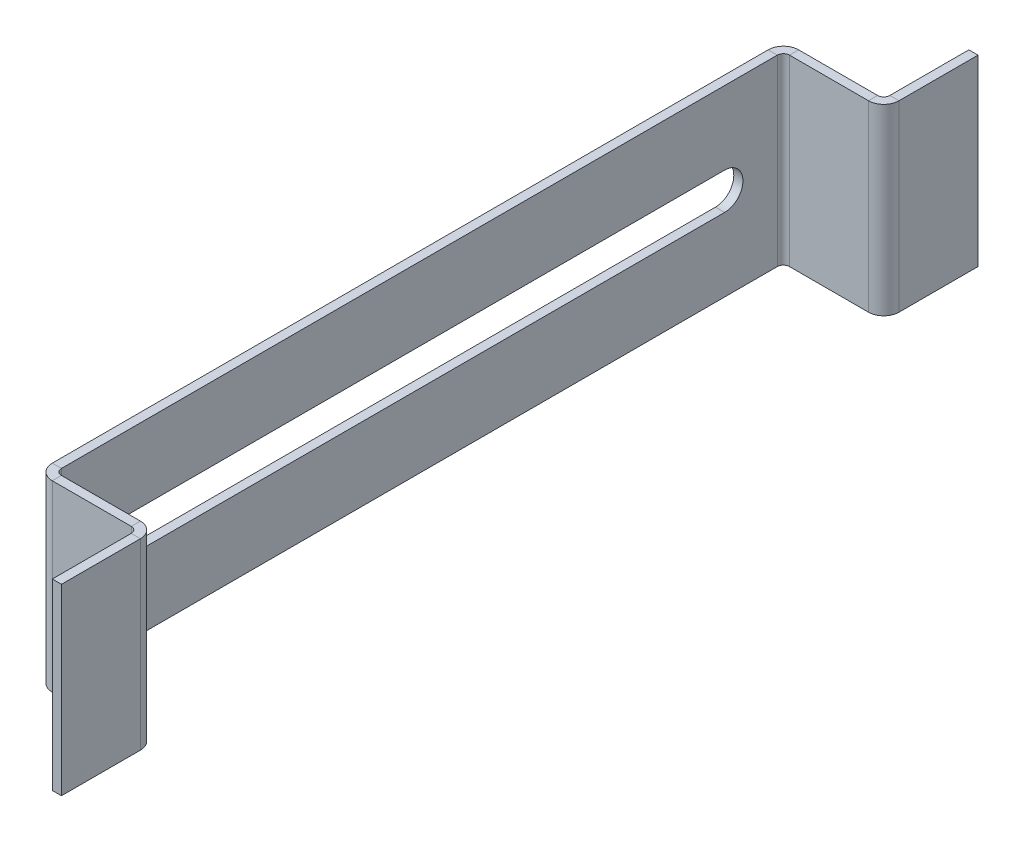
ISO-10303-21;
HEADER;
FILE_DESCRIPTION(('STEP AP214'),'2;1');
FILE_NAME('part.step','',(''),(''),'','','');
FILE_SCHEMA(('AUTOMOTIVE_DESIGN { 1 0 10303 214 1 1 1 1 }'));
ENDSEC;
DATA;
#1=APPLICATION_CONTEXT('core data for automotive mechanical design processes');
#2=APPLICATION_PROTOCOL_DEFINITION('international standard','automotive_design',2000,#1);
#3=PRODUCT_CONTEXT('',#1,'mechanical');
#4=PRODUCT('Part','Part','',(#3));
#5=PRODUCT_RELATED_PRODUCT_CATEGORY('part','',(#4));
#6=PRODUCT_DEFINITION_FORMATION('','',#4);
#7=PRODUCT_DEFINITION_CONTEXT('part definition',#1,'design');
#8=PRODUCT_DEFINITION('design','',#6,#7);
#9=PRODUCT_DEFINITION_SHAPE('','',#8);
#10=(LENGTH_UNIT() NAMED_UNIT(*) SI_UNIT(.MILLI.,.METRE.));
#11=(NAMED_UNIT(*) PLANE_ANGLE_UNIT() SI_UNIT($,.RADIAN.));
#12=(NAMED_UNIT(*) SI_UNIT($,.STERADIAN.) SOLID_ANGLE_UNIT());
#13=UNCERTAINTY_MEASURE_WITH_UNIT(LENGTH_MEASURE(1.E-05),#10,'distance_accuracy_value','');
#14=(GEOMETRIC_REPRESENTATION_CONTEXT(3) GLOBAL_UNCERTAINTY_ASSIGNED_CONTEXT((#13)) GLOBAL_UNIT_ASSIGNED_CONTEXT((#10,
#11,#12)) REPRESENTATION_CONTEXT('',''));
#15=CARTESIAN_POINT('',(0.,0.,0.));
#16=DIRECTION('',(0.,0.,1.));
#17=DIRECTION('',(1.,0.,0.));
#18=AXIS2_PLACEMENT_3D('',#15,#16,#17);
#19=CARTESIAN_POINT('',(-121.502212856217,-1.27270623107923E-13,121.502212856219));
#20=DIRECTION('',(0.,0.,1.));
#21=DIRECTION('',(1.,0.,0.));
#22=AXIS2_PLACEMENT_3D('',#19,#20,#21);
#23=PLANE('',#22);
#24=DIRECTION('',(1.,0.,0.));
#25=VECTOR('',#24,1.);
#26=CARTESIAN_POINT('',(-121.502212856217,14.9999999999999,121.502212856219));
#27=LINE('',#26,#25);
#28=CARTESIAN_POINT('',(-47.1894362491901,14.9999999999999,121.502212856219));
#29=VERTEX_POINT('',#28);
#30=CARTESIAN_POINT('',(-60.1277660702719,14.9999999999999,121.502212856219));
#31=VERTEX_POINT('',#30);
#32=EDGE_CURVE('E72',#29,#31,#27,.F.);
#33=ORIENTED_EDGE('',*,*,#32,.F.);
#34=DIRECTION('',(0.,-1.,0.));
#35=VECTOR('',#34,1.);
#36=CARTESIAN_POINT('',(-47.1894362491901,0.,121.502212856219));
#37=LINE('',#36,#35);
#38=CARTESIAN_POINT('',(-47.1894362491901,-15.0000000000001,121.502212856219));
#39=VERTEX_POINT('',#38);
#40=EDGE_CURVE('E64',#29,#39,#37,.T.);
#41=ORIENTED_EDGE('',*,*,#40,.T.);
#42=DIRECTION('',(1.,0.,0.));
#43=VECTOR('',#42,1.);
#44=CARTESIAN_POINT('',(-121.502212856217,-15.0000000000001,121.502212856219));
#45=LINE('',#44,#43);
#46=CARTESIAN_POINT('',(-60.1277660702718,-15.0000000000001,121.502212856219));
#47=VERTEX_POINT('',#46);
#48=EDGE_CURVE('E80',#47,#39,#45,.T.);
#49=ORIENTED_EDGE('',*,*,#48,.F.);
#50=DIRECTION('',(0.,1.,0.));
#51=VECTOR('',#50,1.);
#52=CARTESIAN_POINT('',(-60.1277660702718,0.,121.502212856219));
#53=LINE('',#52,#51);
#54=EDGE_CURVE('E348',#47,#31,#53,.T.);
#55=ORIENTED_EDGE('',*,*,#54,.T.);
#56=EDGE_LOOP('',(#33,#41,#49,#55));
#57=FACE_BOUND('',#56,.T.);
#58=ADVANCED_FACE('F55',(#57),#23,.F.);
#59=CARTESIAN_POINT('',(-121.502212856217,-1.54332309333161E-13,242.253319284328));
#60=DIRECTION('',(0.,0.,-1.));
#61=DIRECTION('',(-1.,0.,0.));
#62=AXIS2_PLACEMENT_3D('',#59,#60,#61);
#63=PLANE('',#62);
#64=DIRECTION('',(1.,0.,0.));
#65=VECTOR('',#64,1.);
#66=CARTESIAN_POINT('',(-31.5022128562171,15.,242.253319284327));
#67=LINE('',#66,#65);
#68=CARTESIAN_POINT('',(-60.1277660702715,14.9999999999999,242.253319284327));
#69=VERTEX_POINT('',#68);
#70=CARTESIAN_POINT('',(-47.1894362491899,15.,242.253319284327));
#71=VERTEX_POINT('',#70);
#72=EDGE_CURVE('E319',#69,#71,#67,.T.);
#73=ORIENTED_EDGE('',*,*,#72,.T.);
#74=DIRECTION('',(0.,-1.,0.));
#75=VECTOR('',#74,1.);
#76=CARTESIAN_POINT('',(-47.1894362491898,0.,242.253319284327));
#77=LINE('',#76,#75);
#78=CARTESIAN_POINT('',(-47.1894362491898,-15.,242.253319284327));
#79=VERTEX_POINT('',#78);
#80=EDGE_CURVE('E418',#71,#79,#77,.T.);
#81=ORIENTED_EDGE('',*,*,#80,.T.);
#82=DIRECTION('',(-1.,0.,0.));
#83=VECTOR('',#82,1.);
#84=CARTESIAN_POINT('',(-31.502212856217,-15.,242.253319284327));
#85=LINE('',#84,#83);
#86=CARTESIAN_POINT('',(-60.1277660702715,-15.0000000000001,242.253319284327));
#87=VERTEX_POINT('',#86);
#88=EDGE_CURVE('E322',#79,#87,#85,.T.);
#89=ORIENTED_EDGE('',*,*,#88,.T.);
#90=DIRECTION('',(0.,1.,0.));
#91=VECTOR('',#90,1.);
#92=CARTESIAN_POINT('',(-60.1277660702714,0.,242.253319284327));
#93=LINE('',#92,#91);
#94=EDGE_CURVE('E320',#87,#69,#93,.T.);
#95=ORIENTED_EDGE('',*,*,#94,.T.);
#96=EDGE_LOOP('',(#73,#81,#89,#95));
#97=FACE_BOUND('',#96,.T.);
#98=ADVANCED_FACE('F498',(#97),#63,.T.);
#99=CARTESIAN_POINT('',(-31.5022128562171,15.,242.253319284327));
#100=DIRECTION('',(0.,1.,0.));
#101=DIRECTION('',(1.,0.,0.));
#102=AXIS2_PLACEMENT_3D('',#99,#100,#101);
#103=PLANE('',#102);
#104=DIRECTION('',(-1.,0.,0.));
#105=VECTOR('',#104,1.);
#106=CARTESIAN_POINT('',(-121.502212856217,14.9999999999999,243.753319284328));
#107=LINE('',#106,#105);
#108=CARTESIAN_POINT('',(-60.1277660702715,14.9999999999999,243.753319284327));
#109=VERTEX_POINT('',#108);
#110=CARTESIAN_POINT('',(-47.1894362491899,15.,243.753319284327));
#111=VERTEX_POINT('',#110);
#112=EDGE_CURVE('E318',#109,#111,#107,.F.);
#113=ORIENTED_EDGE('',*,*,#112,.T.);
#114=DIRECTION('',(0.,0.,-1.));
#115=VECTOR('',#114,1.);
#116=CARTESIAN_POINT('',(-47.1894362491899,15.,242.253319284327));
#117=LINE('',#116,#115);
#118=EDGE_CURVE('E427',#111,#71,#117,.T.);
#119=ORIENTED_EDGE('',*,*,#118,.T.);
#120=ORIENTED_EDGE('',*,*,#72,.F.);
#121=DIRECTION('',(0.,0.,1.));
#122=VECTOR('',#121,1.);
#123=CARTESIAN_POINT('',(-60.1277660702715,14.9999999999999,242.253319284327));
#124=LINE('',#123,#122);
#125=EDGE_CURVE('E315',#69,#109,#124,.T.);
#126=ORIENTED_EDGE('',*,*,#125,.T.);
#127=EDGE_LOOP('',(#113,#119,#120,#126));
#128=FACE_BOUND('',#127,.T.);
#129=ADVANCED_FACE('F481',(#128),#103,.T.);
#130=CARTESIAN_POINT('',(-31.502212856217,-15.,242.253319284327));
#131=DIRECTION('',(0.,-1.,0.));
#132=DIRECTION('',(-1.,0.,0.));
#133=AXIS2_PLACEMENT_3D('',#130,#131,#132);
#134=PLANE('',#133);
#135=ORIENTED_EDGE('',*,*,#88,.F.);
#136=DIRECTION('',(0.,0.,1.));
#137=VECTOR('',#136,1.);
#138=CARTESIAN_POINT('',(-47.1894362491898,-15.,242.253319284327));
#139=LINE('',#138,#137);
#140=CARTESIAN_POINT('',(-47.1894362491898,-15.,243.753319284327));
#141=VERTEX_POINT('',#140);
#142=EDGE_CURVE('E432',#79,#141,#139,.T.);
#143=ORIENTED_EDGE('',*,*,#142,.T.);
#144=DIRECTION('',(-1.,0.,0.));
#145=VECTOR('',#144,1.);
#146=CARTESIAN_POINT('',(-121.502212856217,-15.0000000000001,243.753319284328));
#147=LINE('',#146,#145);
#148=CARTESIAN_POINT('',(-60.1277660702714,-15.0000000000001,243.753319284327));
#149=VERTEX_POINT('',#148);
#150=EDGE_CURVE('E314',#141,#149,#147,.T.);
#151=ORIENTED_EDGE('',*,*,#150,.T.);
#152=DIRECTION('',(0.,0.,-1.));
#153=VECTOR('',#152,1.);
#154=CARTESIAN_POINT('',(-60.1277660702714,-15.0000000000001,242.253319284327));
#155=LINE('',#154,#153);
#156=EDGE_CURVE('E310',#149,#87,#155,.T.);
#157=ORIENTED_EDGE('',*,*,#156,.T.);
#158=EDGE_LOOP('',(#135,#143,#151,#157));
#159=FACE_BOUND('',#158,.T.);
#160=ADVANCED_FACE('F496',(#159),#134,.T.);
#161=CARTESIAN_POINT('',(-62.6277660702717,0.,182.627766070273));
#162=DIRECTION('',(1.,0.,0.));
#163=DIRECTION('',(0.,0.,-1.));
#164=AXIS2_PLACEMENT_3D('',#161,#162,#163);
#165=PLANE('',#164);
#166=CARTESIAN_POINT('',(-62.6277660702715,0.,232.627766070273));
#167=DIRECTION('',(1.,0.,0.));
#168=DIRECTION('',(0.,0.,-1.));
#169=AXIS2_PLACEMENT_3D('',#166,#167,#168);
#170=CIRCLE('',#169,3.);
#171=CARTESIAN_POINT('',(-62.6277660702715,2.99999999999993,232.627766070273));
#172=VERTEX_POINT('',#171);
#173=CARTESIAN_POINT('',(-62.6277660702715,-3.00000000000007,232.627766070273));
#174=VERTEX_POINT('',#173);
#175=EDGE_CURVE('E373',#172,#174,#170,.T.);
#176=ORIENTED_EDGE('',*,*,#175,.T.);
#177=DIRECTION('',(0.,0.,-1.));
#178=VECTOR('',#177,1.);
#179=CARTESIAN_POINT('',(-62.6277660702717,-3.00000000000007,182.627766070273));
#180=LINE('',#179,#178);
#181=CARTESIAN_POINT('',(-62.6277660702719,-3.00000000000006,132.627766070273));
#182=VERTEX_POINT('',#181);
#183=EDGE_CURVE('E377',#174,#182,#180,.T.);
#184=ORIENTED_EDGE('',*,*,#183,.T.);
#185=CARTESIAN_POINT('',(-62.6277660702719,0.,132.627766070273));
#186=DIRECTION('',(1.,0.,0.));
#187=DIRECTION('',(0.,0.,-1.));
#188=AXIS2_PLACEMENT_3D('',#185,#186,#187);
#189=CIRCLE('',#188,3.);
#190=CARTESIAN_POINT('',(-62.6277660702719,2.99999999999994,132.627766070273));
#191=VERTEX_POINT('',#190);
#192=EDGE_CURVE('E381',#182,#191,#189,.T.);
#193=ORIENTED_EDGE('',*,*,#192,.T.);
#194=DIRECTION('',(0.,0.,-1.));
#195=VECTOR('',#194,1.);
#196=CARTESIAN_POINT('',(-62.6277660702717,2.99999999999994,182.627766070273));
#197=LINE('',#196,#195);
#198=EDGE_CURVE('E376',#191,#172,#197,.F.);
#199=ORIENTED_EDGE('',*,*,#198,.T.);
#200=EDGE_LOOP('',(#176,#184,#193,#199));
#201=FACE_BOUND('',#200,.T.);
#202=DIRECTION('',(0.,0.,-1.));
#203=VECTOR('',#202,1.);
#204=CARTESIAN_POINT('',(-62.6277660702717,-15.0000000000001,182.627766070273));
#205=LINE('',#204,#203);
#206=CARTESIAN_POINT('',(-62.6277660702715,-15.0000000000001,241.253319284327));
#207=VERTEX_POINT('',#206);
#208=CARTESIAN_POINT('',(-62.6277660702718,-15.0000000000001,124.002212856219));
#209=VERTEX_POINT('',#208);
#210=EDGE_CURVE('E363',#207,#209,#205,.T.);
#211=ORIENTED_EDGE('',*,*,#210,.F.);
#212=DIRECTION('',(0.,1.,0.));
#213=VECTOR('',#212,1.);
#214=CARTESIAN_POINT('',(-62.6277660702715,0.,241.253319284327));
#215=LINE('',#214,#213);
#216=CARTESIAN_POINT('',(-62.6277660702715,14.9999999999999,241.253319284327));
#217=VERTEX_POINT('',#216);
#218=EDGE_CURVE('E412',#207,#217,#215,.T.);
#219=ORIENTED_EDGE('',*,*,#218,.T.);
#220=DIRECTION('',(0.,0.,-1.));
#221=VECTOR('',#220,1.);
#222=CARTESIAN_POINT('',(-62.6277660702717,14.9999999999999,182.627766070273));
#223=LINE('',#222,#221);
#224=CARTESIAN_POINT('',(-62.6277660702719,14.9999999999999,124.002212856219));
#225=VERTEX_POINT('',#224);
#226=EDGE_CURVE('E380',#225,#217,#223,.F.);
#227=ORIENTED_EDGE('',*,*,#226,.F.);
#228=DIRECTION('',(0.,1.,0.));
#229=VECTOR('',#228,1.);
#230=CARTESIAN_POINT('',(-62.6277660702719,0.,124.002212856219));
#231=LINE('',#230,#229);
#232=EDGE_CURVE('E401',#209,#225,#231,.T.);
#233=ORIENTED_EDGE('',*,*,#232,.F.);
#234=EDGE_LOOP('',(#211,#219,#227,#233));
#235=FACE_BOUND('',#234,.T.);
#236=ADVANCED_FACE('F553',(#201,#235),#165,.F.);
#237=CARTESIAN_POINT('',(-61.1277660702714,-15.0000000000001,272.627766070273));
#238=DIRECTION('',(0.,-1.,0.));
#239=DIRECTION('',(0.,0.,-1.));
#240=AXIS2_PLACEMENT_3D('',#237,#238,#239);
#241=PLANE('',#240);
#242=DIRECTION('',(1.,0.,0.));
#243=VECTOR('',#242,1.);
#244=CARTESIAN_POINT('',(-61.1277660702715,-15.0000000000001,241.253319284327));
#245=LINE('',#244,#243);
#246=CARTESIAN_POINT('',(-61.1277660702715,-15.0000000000001,241.253319284327));
#247=VERTEX_POINT('',#246);
#248=EDGE_CURVE('E415',#207,#247,#245,.T.);
#249=ORIENTED_EDGE('',*,*,#248,.F.);
#250=ORIENTED_EDGE('',*,*,#210,.T.);
#251=DIRECTION('',(1.,0.,0.));
#252=VECTOR('',#251,1.);
#253=CARTESIAN_POINT('',(-61.1277660702719,-15.0000000000001,124.002212856218));
#254=LINE('',#253,#252);
#255=CARTESIAN_POINT('',(-61.1277660702718,-15.0000000000001,124.002212856219));
#256=VERTEX_POINT('',#255);
#257=EDGE_CURVE('E398',#209,#256,#254,.T.);
#258=ORIENTED_EDGE('',*,*,#257,.T.);
#259=DIRECTION('',(0.,0.,-1.));
#260=VECTOR('',#259,1.);
#261=CARTESIAN_POINT('',(-61.1277660702714,-15.0000000000001,272.627766070273));
#262=LINE('',#261,#260);
#263=EDGE_CURVE('E395',#247,#256,#262,.T.);
#264=ORIENTED_EDGE('',*,*,#263,.F.);
#265=EDGE_LOOP('',(#249,#250,#258,#264));
#266=FACE_BOUND('',#265,.T.);
#267=ADVANCED_FACE('F557',(#266),#241,.T.);
#268=CARTESIAN_POINT('',(-61.1277660702714,14.9999999999999,272.627766070273));
#269=DIRECTION('',(0.,1.,0.));
#270=DIRECTION('',(0.,0.,1.));
#271=AXIS2_PLACEMENT_3D('',#268,#269,#270);
#272=PLANE('',#271);
#273=DIRECTION('',(-1.,0.,0.));
#274=VECTOR('',#273,1.);
#275=CARTESIAN_POINT('',(-61.1277660702715,14.9999999999999,241.253319284327));
#276=LINE('',#275,#274);
#277=CARTESIAN_POINT('',(-61.1277660702715,14.9999999999999,241.253319284327));
#278=VERTEX_POINT('',#277);
#279=EDGE_CURVE('E409',#278,#217,#276,.T.);
#280=ORIENTED_EDGE('',*,*,#279,.F.);
#281=DIRECTION('',(0.,0.,1.));
#282=VECTOR('',#281,1.);
#283=CARTESIAN_POINT('',(-61.1277660702714,14.9999999999999,272.627766070273));
#284=LINE('',#283,#282);
#285=CARTESIAN_POINT('',(-61.1277660702719,14.9999999999999,124.002212856219));
#286=VERTEX_POINT('',#285);
#287=EDGE_CURVE('E372',#286,#278,#284,.T.);
#288=ORIENTED_EDGE('',*,*,#287,.F.);
#289=DIRECTION('',(-1.,0.,0.));
#290=VECTOR('',#289,1.);
#291=CARTESIAN_POINT('',(-61.1277660702719,14.9999999999999,124.002212856218));
#292=LINE('',#291,#290);
#293=EDGE_CURVE('E403',#286,#225,#292,.T.);
#294=ORIENTED_EDGE('',*,*,#293,.T.);
#295=ORIENTED_EDGE('',*,*,#226,.T.);
#296=EDGE_LOOP('',(#280,#288,#294,#295));
#297=FACE_BOUND('',#296,.T.);
#298=ADVANCED_FACE('F469',(#297),#272,.T.);
#299=CARTESIAN_POINT('',(-61.1277660702717,0.,182.627766070273));
#300=DIRECTION('',(1.,0.,0.));
#301=DIRECTION('',(0.,0.,-1.));
#302=AXIS2_PLACEMENT_3D('',#299,#300,#301);
#303=PLANE('',#302);
#304=DIRECTION('',(0.,1.,0.));
#305=VECTOR('',#304,1.);
#306=CARTESIAN_POINT('',(-61.1277660702715,0.,241.253319284327));
#307=LINE('',#306,#305);
#308=EDGE_CURVE('E406',#247,#278,#307,.T.);
#309=ORIENTED_EDGE('',*,*,#308,.F.);
#310=ORIENTED_EDGE('',*,*,#263,.T.);
#311=DIRECTION('',(0.,1.,0.));
#312=VECTOR('',#311,1.);
#313=CARTESIAN_POINT('',(-61.1277660702719,0.,124.002212856219));
#314=LINE('',#313,#312);
#315=EDGE_CURVE('E393',#256,#286,#314,.T.);
#316=ORIENTED_EDGE('',*,*,#315,.T.);
#317=ORIENTED_EDGE('',*,*,#287,.T.);
#318=EDGE_LOOP('',(#309,#310,#316,#317));
#319=FACE_BOUND('',#318,.T.);
#320=CARTESIAN_POINT('',(-61.1277660702715,0.,232.627766070273));
#321=DIRECTION('',(1.,0.,0.));
#322=DIRECTION('',(0.,0.,-1.));
#323=AXIS2_PLACEMENT_3D('',#320,#321,#322);
#324=CIRCLE('',#323,3.);
#325=CARTESIAN_POINT('',(-61.1277660702715,2.99999999999993,232.627766070273));
#326=VERTEX_POINT('',#325);
#327=CARTESIAN_POINT('',(-61.1277660702715,-3.00000000000007,232.627766070273));
#328=VERTEX_POINT('',#327);
#329=EDGE_CURVE('E359',#326,#328,#324,.T.);
#330=ORIENTED_EDGE('',*,*,#329,.F.);
#331=DIRECTION('',(0.,0.,1.));
#332=VECTOR('',#331,1.);
#333=CARTESIAN_POINT('',(-61.1277660702715,2.99999999999993,232.627766070273));
#334=LINE('',#333,#332);
#335=CARTESIAN_POINT('',(-61.1277660702719,2.99999999999994,132.627766070273));
#336=VERTEX_POINT('',#335);
#337=EDGE_CURVE('E362',#336,#326,#334,.T.);
#338=ORIENTED_EDGE('',*,*,#337,.F.);
#339=CARTESIAN_POINT('',(-61.1277660702719,0.,132.627766070273));
#340=DIRECTION('',(1.,0.,0.));
#341=DIRECTION('',(0.,0.,-1.));
#342=AXIS2_PLACEMENT_3D('',#339,#340,#341);
#343=CIRCLE('',#342,3.);
#344=CARTESIAN_POINT('',(-61.1277660702719,-3.00000000000006,132.627766070273));
#345=VERTEX_POINT('',#344);
#346=EDGE_CURVE('E366',#345,#336,#343,.T.);
#347=ORIENTED_EDGE('',*,*,#346,.F.);
#348=DIRECTION('',(0.,0.,-1.));
#349=VECTOR('',#348,1.);
#350=CARTESIAN_POINT('',(-61.1277660702715,-3.00000000000007,232.627766070273));
#351=LINE('',#350,#349);
#352=EDGE_CURVE('E369',#328,#345,#351,.T.);
#353=ORIENTED_EDGE('',*,*,#352,.F.);
#354=EDGE_LOOP('',(#330,#338,#347,#353));
#355=FACE_BOUND('',#354,.T.);
#356=ADVANCED_FACE('F466',(#319,#355),#303,.T.);
#357=CARTESIAN_POINT('',(-61.1277660702719,0.,132.627766070273));
#358=DIRECTION('',(1.,0.,0.));
#359=DIRECTION('',(0.,0.,-1.));
#360=AXIS2_PLACEMENT_3D('',#357,#358,#359);
#361=CYLINDRICAL_SURFACE('',#360,3.);
#362=DIRECTION('',(1.,0.,0.));
#363=VECTOR('',#362,1.);
#364=CARTESIAN_POINT('',(-61.1277660702719,2.99999999999994,132.627766070273));
#365=LINE('',#364,#363);
#366=EDGE_CURVE('E391',#191,#336,#365,.T.);
#367=ORIENTED_EDGE('',*,*,#366,.F.);
#368=ORIENTED_EDGE('',*,*,#192,.F.);
#369=DIRECTION('',(1.,0.,0.));
#370=VECTOR('',#369,1.);
#371=CARTESIAN_POINT('',(-61.1277660702719,-3.00000000000006,132.627766070273));
#372=LINE('',#371,#370);
#373=EDGE_CURVE('E388',#182,#345,#372,.T.);
#374=ORIENTED_EDGE('',*,*,#373,.T.);
#375=ORIENTED_EDGE('',*,*,#346,.T.);
#376=EDGE_LOOP('',(#367,#368,#374,#375));
#377=FACE_BOUND('',#376,.T.);
#378=ADVANCED_FACE('F568',(#377),#361,.F.);
#379=CARTESIAN_POINT('',(-61.1277660702715,-3.00000000000007,232.627766070273));
#380=DIRECTION('',(0.,-1.,0.));
#381=DIRECTION('',(0.,0.,-1.));
#382=AXIS2_PLACEMENT_3D('',#379,#380,#381);
#383=PLANE('',#382);
#384=ORIENTED_EDGE('',*,*,#373,.F.);
#385=ORIENTED_EDGE('',*,*,#183,.F.);
#386=DIRECTION('',(1.,0.,0.));
#387=VECTOR('',#386,1.);
#388=CARTESIAN_POINT('',(-61.1277660702715,-3.00000000000007,232.627766070273));
#389=LINE('',#388,#387);
#390=EDGE_CURVE('E386',#174,#328,#389,.T.);
#391=ORIENTED_EDGE('',*,*,#390,.T.);
#392=ORIENTED_EDGE('',*,*,#352,.T.);
#393=EDGE_LOOP('',(#384,#385,#391,#392));
#394=FACE_BOUND('',#393,.T.);
#395=ADVANCED_FACE('F575',(#394),#383,.F.);
#396=CARTESIAN_POINT('',(-61.1277660702715,0.,232.627766070273));
#397=DIRECTION('',(1.,0.,0.));
#398=DIRECTION('',(0.,0.,-1.));
#399=AXIS2_PLACEMENT_3D('',#396,#397,#398);
#400=CYLINDRICAL_SURFACE('',#399,3.);
#401=ORIENTED_EDGE('',*,*,#390,.F.);
#402=ORIENTED_EDGE('',*,*,#175,.F.);
#403=DIRECTION('',(1.,0.,0.));
#404=VECTOR('',#403,1.);
#405=CARTESIAN_POINT('',(-61.1277660702715,2.99999999999993,232.627766070273));
#406=LINE('',#405,#404);
#407=EDGE_CURVE('E389',#172,#326,#406,.T.);
#408=ORIENTED_EDGE('',*,*,#407,.T.);
#409=ORIENTED_EDGE('',*,*,#329,.T.);
#410=EDGE_LOOP('',(#401,#402,#408,#409));
#411=FACE_BOUND('',#410,.T.);
#412=ADVANCED_FACE('F571',(#411),#400,.F.);
#413=CARTESIAN_POINT('',(-61.1277660702715,2.99999999999993,232.627766070273));
#414=DIRECTION('',(0.,1.,0.));
#415=DIRECTION('',(0.,0.,1.));
#416=AXIS2_PLACEMENT_3D('',#413,#414,#415);
#417=PLANE('',#416);
#418=ORIENTED_EDGE('',*,*,#198,.F.);
#419=ORIENTED_EDGE('',*,*,#366,.T.);
#420=ORIENTED_EDGE('',*,*,#337,.T.);
#421=ORIENTED_EDGE('',*,*,#407,.F.);
#422=EDGE_LOOP('',(#418,#419,#420,#421));
#423=FACE_BOUND('',#422,.T.);
#424=ADVANCED_FACE('F551',(#423),#417,.F.);
#425=CARTESIAN_POINT('',(-121.502212856217,-1.27270623107923E-13,123.002212856219));
#426=DIRECTION('',(0.,0.,1.));
#427=DIRECTION('',(1.,0.,0.));
#428=AXIS2_PLACEMENT_3D('',#425,#426,#427);
#429=PLANE('',#428);
#430=DIRECTION('',(0.,-1.,0.));
#431=VECTOR('',#430,1.);
#432=CARTESIAN_POINT('',(-47.1894362491901,0.,123.002212856219));
#433=LINE('',#432,#431);
#434=CARTESIAN_POINT('',(-47.1894362491902,14.9999999999999,123.002212856219));
#435=VERTEX_POINT('',#434);
#436=CARTESIAN_POINT('',(-47.1894362491902,-15.,123.002212856218));
#437=VERTEX_POINT('',#436);
#438=EDGE_CURVE('E238',#435,#437,#433,.T.);
#439=ORIENTED_EDGE('',*,*,#438,.F.);
#440=DIRECTION('',(-1.,0.,0.));
#441=VECTOR('',#440,1.);
#442=CARTESIAN_POINT('',(-211.502212856217,14.9999999999998,123.002212856219));
#443=LINE('',#442,#441);
#444=CARTESIAN_POINT('',(-60.1277660702719,14.9999999999999,123.002212856219));
#445=VERTEX_POINT('',#444);
#446=EDGE_CURVE('E59',#435,#445,#443,.T.);
#447=ORIENTED_EDGE('',*,*,#446,.T.);
#448=DIRECTION('',(0.,1.,0.));
#449=VECTOR('',#448,1.);
#450=CARTESIAN_POINT('',(-60.1277660702718,0.,123.002212856219));
#451=LINE('',#450,#449);
#452=CARTESIAN_POINT('',(-60.1277660702719,-15.0000000000001,123.002212856219));
#453=VERTEX_POINT('',#452);
#454=EDGE_CURVE('E343',#453,#445,#451,.T.);
#455=ORIENTED_EDGE('',*,*,#454,.F.);
#456=DIRECTION('',(1.,0.,0.));
#457=VECTOR('',#456,1.);
#458=CARTESIAN_POINT('',(-211.502212856217,-15.0000000000002,123.002212856219));
#459=LINE('',#458,#457);
#460=EDGE_CURVE('E353',#453,#437,#459,.T.);
#461=ORIENTED_EDGE('',*,*,#460,.T.);
#462=EDGE_LOOP('',(#439,#447,#455,#461));
#463=FACE_BOUND('',#462,.T.);
#464=ADVANCED_FACE('F451',(#463),#429,.T.);
#465=CARTESIAN_POINT('',(-211.502212856217,-15.0000000000002,123.002212856219));
#466=DIRECTION('',(0.,-1.,0.));
#467=DIRECTION('',(1.,0.,0.));
#468=AXIS2_PLACEMENT_3D('',#465,#466,#467);
#469=PLANE('',#468);
#470=DIRECTION('',(0.,0.,-1.));
#471=VECTOR('',#470,1.);
#472=CARTESIAN_POINT('',(-47.1894362491901,-15.0000000000001,123.002212856219));
#473=LINE('',#472,#471);
#474=EDGE_CURVE('E442',#437,#39,#473,.T.);
#475=ORIENTED_EDGE('',*,*,#474,.F.);
#476=ORIENTED_EDGE('',*,*,#460,.F.);
#477=DIRECTION('',(0.,0.,1.));
#478=VECTOR('',#477,1.);
#479=CARTESIAN_POINT('',(-60.1277660702718,-15.0000000000001,123.002212856219));
#480=LINE('',#479,#478);
#481=EDGE_CURVE('E350',#47,#453,#480,.T.);
#482=ORIENTED_EDGE('',*,*,#481,.F.);
#483=ORIENTED_EDGE('',*,*,#48,.T.);
#484=EDGE_LOOP('',(#475,#476,#482,#483));
#485=FACE_BOUND('',#484,.T.);
#486=ADVANCED_FACE('F546',(#485),#469,.T.);
#487=CARTESIAN_POINT('',(-211.502212856217,14.9999999999998,123.002212856219));
#488=DIRECTION('',(0.,1.,0.));
#489=DIRECTION('',(-1.,0.,0.));
#490=AXIS2_PLACEMENT_3D('',#487,#488,#489);
#491=PLANE('',#490);
#492=DIRECTION('',(0.,0.,1.));
#493=VECTOR('',#492,1.);
#494=CARTESIAN_POINT('',(-47.1894362491901,14.9999999999999,123.002212856219));
#495=LINE('',#494,#493);
#496=EDGE_CURVE('E12',#29,#435,#495,.T.);
#497=ORIENTED_EDGE('',*,*,#496,.F.);
#498=ORIENTED_EDGE('',*,*,#32,.T.);
#499=DIRECTION('',(0.,0.,-1.));
#500=VECTOR('',#499,1.);
#501=CARTESIAN_POINT('',(-60.1277660702719,14.9999999999999,123.002212856219));
#502=LINE('',#501,#500);
#503=EDGE_CURVE('E354',#445,#31,#502,.T.);
#504=ORIENTED_EDGE('',*,*,#503,.F.);
#505=ORIENTED_EDGE('',*,*,#446,.F.);
#506=EDGE_LOOP('',(#497,#498,#504,#505));
#507=FACE_BOUND('',#506,.T.);
#508=ADVANCED_FACE('F57',(#507),#491,.T.);
#509=CARTESIAN_POINT('',(-60.1277660702718,-15.0000000000001,124.002212856219));
#510=DIRECTION('',(0.,1.,0.));
#511=DIRECTION('',(0.,0.,1.));
#512=AXIS2_PLACEMENT_3D('',#509,#510,#511);
#513=PLANE('',#512);
#514=ORIENTED_EDGE('',*,*,#257,.F.);
#515=CARTESIAN_POINT('',(-60.1277660702718,-15.0000000000001,124.002212856219));
#516=DIRECTION('',(0.,-1.,0.));
#517=DIRECTION('',(0.,0.,-1.));
#518=AXIS2_PLACEMENT_3D('',#515,#516,#517);
#519=CIRCLE('',#518,2.5);
#520=EDGE_CURVE('E332',#209,#47,#519,.T.);
#521=ORIENTED_EDGE('',*,*,#520,.T.);
#522=ORIENTED_EDGE('',*,*,#481,.T.);
#523=CARTESIAN_POINT('',(-60.1277660702718,-15.0000000000001,124.002212856219));
#524=DIRECTION('',(0.,-1.,0.));
#525=DIRECTION('',(0.,0.,-1.));
#526=AXIS2_PLACEMENT_3D('',#523,#524,#525);
#527=CIRCLE('',#526,1.);
#528=EDGE_CURVE('E337',#256,#453,#527,.T.);
#529=ORIENTED_EDGE('',*,*,#528,.F.);
#530=EDGE_LOOP('',(#514,#521,#522,#529));
#531=FACE_BOUND('',#530,.T.);
#532=ADVANCED_FACE('F585',(#531),#513,.F.);
#533=CARTESIAN_POINT('',(-60.1277660702719,14.9999999999999,124.002212856219));
#534=DIRECTION('',(0.,-1.,0.));
#535=DIRECTION('',(0.,0.,-1.));
#536=AXIS2_PLACEMENT_3D('',#533,#534,#535);
#537=PLANE('',#536);
#538=CARTESIAN_POINT('',(-60.1277660702719,14.9999999999999,124.002212856219));
#539=DIRECTION('',(0.,-1.,0.));
#540=DIRECTION('',(0.,0.,-1.));
#541=AXIS2_PLACEMENT_3D('',#538,#539,#540);
#542=CIRCLE('',#541,2.5);
#543=EDGE_CURVE('E341',#31,#225,#542,.F.);
#544=ORIENTED_EDGE('',*,*,#543,.T.);
#545=ORIENTED_EDGE('',*,*,#293,.F.);
#546=CARTESIAN_POINT('',(-60.1277660702719,14.9999999999999,124.002212856219));
#547=DIRECTION('',(0.,1.,0.));
#548=DIRECTION('',(0.,0.,1.));
#549=AXIS2_PLACEMENT_3D('',#546,#547,#548);
#550=CIRCLE('',#549,1.);
#551=EDGE_CURVE('E340',#445,#286,#550,.T.);
#552=ORIENTED_EDGE('',*,*,#551,.F.);
#553=ORIENTED_EDGE('',*,*,#503,.T.);
#554=EDGE_LOOP('',(#544,#545,#552,#553));
#555=FACE_BOUND('',#554,.T.);
#556=ADVANCED_FACE('F460',(#555),#537,.F.);
#557=CARTESIAN_POINT('',(-60.1277660702719,30.1629974616181,124.002212856219));
#558=DIRECTION('',(0.,-1.,0.));
#559=DIRECTION('',(0.,0.,-1.));
#560=AXIS2_PLACEMENT_3D('',#557,#558,#559);
#561=CYLINDRICAL_SURFACE('',#560,1.);
#562=ORIENTED_EDGE('',*,*,#454,.T.);
#563=ORIENTED_EDGE('',*,*,#551,.T.);
#564=ORIENTED_EDGE('',*,*,#315,.F.);
#565=ORIENTED_EDGE('',*,*,#528,.T.);
#566=EDGE_LOOP('',(#562,#563,#564,#565));
#567=FACE_BOUND('',#566,.T.);
#568=ADVANCED_FACE('F457',(#567),#561,.F.);
#569=CARTESIAN_POINT('',(-60.1277660702719,30.1629974616181,124.002212856219));
#570=DIRECTION('',(0.,-1.,0.));
#571=DIRECTION('',(0.,0.,-1.));
#572=AXIS2_PLACEMENT_3D('',#569,#570,#571);
#573=CYLINDRICAL_SURFACE('',#572,2.5);
#574=ORIENTED_EDGE('',*,*,#54,.F.);
#575=ORIENTED_EDGE('',*,*,#520,.F.);
#576=ORIENTED_EDGE('',*,*,#232,.T.);
#577=ORIENTED_EDGE('',*,*,#543,.F.);
#578=EDGE_LOOP('',(#574,#575,#576,#577));
#579=FACE_BOUND('',#578,.T.);
#580=ADVANCED_FACE('F589',(#579),#573,.T.);
#581=CARTESIAN_POINT('',(-60.1277660702715,-15.0000000000001,241.253319284327));
#582=DIRECTION('',(0.,1.,0.));
#583=DIRECTION('',(0.,0.,1.));
#584=AXIS2_PLACEMENT_3D('',#581,#582,#583);
#585=PLANE('',#584);
#586=ORIENTED_EDGE('',*,*,#156,.F.);
#587=CARTESIAN_POINT('',(-60.1277660702715,-15.0000000000001,241.253319284327));
#588=DIRECTION('',(0.,-1.,0.));
#589=DIRECTION('',(0.,0.,-1.));
#590=AXIS2_PLACEMENT_3D('',#587,#588,#589);
#591=CIRCLE('',#590,2.5);
#592=EDGE_CURVE('E313',#149,#207,#591,.T.);
#593=ORIENTED_EDGE('',*,*,#592,.T.);
#594=ORIENTED_EDGE('',*,*,#248,.T.);
#595=CARTESIAN_POINT('',(-60.1277660702715,-15.0000000000001,241.253319284327));
#596=DIRECTION('',(0.,-1.,0.));
#597=DIRECTION('',(0.,0.,-1.));
#598=AXIS2_PLACEMENT_3D('',#595,#596,#597);
#599=CIRCLE('',#598,0.999999999999994);
#600=EDGE_CURVE('E325',#87,#247,#599,.T.);
#601=ORIENTED_EDGE('',*,*,#600,.F.);
#602=EDGE_LOOP('',(#586,#593,#594,#601));
#603=FACE_BOUND('',#602,.T.);
#604=ADVANCED_FACE('F493',(#603),#585,.F.);
#605=CARTESIAN_POINT('',(-60.1277660702715,14.9999999999999,241.253319284327));
#606=DIRECTION('',(0.,-1.,0.));
#607=DIRECTION('',(0.,0.,-1.));
#608=AXIS2_PLACEMENT_3D('',#605,#606,#607);
#609=PLANE('',#608);
#610=CARTESIAN_POINT('',(-60.1277660702715,14.9999999999999,241.253319284327));
#611=DIRECTION('',(0.,-1.,0.));
#612=DIRECTION('',(0.,0.,-1.));
#613=AXIS2_PLACEMENT_3D('',#610,#611,#612);
#614=CIRCLE('',#613,2.5);
#615=EDGE_CURVE('E329',#217,#109,#614,.F.);
#616=ORIENTED_EDGE('',*,*,#615,.T.);
#617=ORIENTED_EDGE('',*,*,#125,.F.);
#618=CARTESIAN_POINT('',(-60.1277660702715,14.9999999999999,241.253319284327));
#619=DIRECTION('',(0.,1.,0.));
#620=DIRECTION('',(0.,0.,1.));
#621=AXIS2_PLACEMENT_3D('',#618,#619,#620);
#622=CIRCLE('',#621,0.999999999999994);
#623=EDGE_CURVE('E328',#278,#69,#622,.T.);
#624=ORIENTED_EDGE('',*,*,#623,.F.);
#625=ORIENTED_EDGE('',*,*,#279,.T.);
#626=EDGE_LOOP('',(#616,#617,#624,#625));
#627=FACE_BOUND('',#626,.T.);
#628=ADVANCED_FACE('F478',(#627),#609,.F.);
#629=CARTESIAN_POINT('',(-60.1277660702715,30.1629974616181,241.253319284327));
#630=DIRECTION('',(0.,-1.,0.));
#631=DIRECTION('',(0.,0.,-1.));
#632=AXIS2_PLACEMENT_3D('',#629,#630,#631);
#633=CYLINDRICAL_SURFACE('',#632,1.);
#634=ORIENTED_EDGE('',*,*,#308,.T.);
#635=ORIENTED_EDGE('',*,*,#623,.T.);
#636=ORIENTED_EDGE('',*,*,#94,.F.);
#637=ORIENTED_EDGE('',*,*,#600,.T.);
#638=EDGE_LOOP('',(#634,#635,#636,#637));
#639=FACE_BOUND('',#638,.T.);
#640=ADVANCED_FACE('F474',(#639),#633,.F.);
#641=CARTESIAN_POINT('',(-60.1277660702715,30.1629974616181,241.253319284327));
#642=DIRECTION('',(0.,-1.,0.));
#643=DIRECTION('',(0.,0.,-1.));
#644=AXIS2_PLACEMENT_3D('',#641,#642,#643);
#645=CYLINDRICAL_SURFACE('',#644,2.5);
#646=ORIENTED_EDGE('',*,*,#218,.F.);
#647=ORIENTED_EDGE('',*,*,#592,.F.);
#648=DIRECTION('',(0.,1.,0.));
#649=VECTOR('',#648,1.);
#650=CARTESIAN_POINT('',(-60.1277660702715,0.,243.753319284327));
#651=LINE('',#650,#649);
#652=EDGE_CURVE('E281',#149,#109,#651,.T.);
#653=ORIENTED_EDGE('',*,*,#652,.T.);
#654=ORIENTED_EDGE('',*,*,#615,.F.);
#655=EDGE_LOOP('',(#646,#647,#653,#654));
#656=FACE_BOUND('',#655,.T.);
#657=ADVANCED_FACE('F487',(#656),#645,.T.);
#658=CARTESIAN_POINT('',(-121.502212856217,-1.55026198723552E-13,243.753319284328));
#659=DIRECTION('',(0.,0.,-1.));
#660=DIRECTION('',(-1.,0.,0.));
#661=AXIS2_PLACEMENT_3D('',#658,#659,#660);
#662=PLANE('',#661);
#663=DIRECTION('',(0.,-1.,0.));
#664=VECTOR('',#663,1.);
#665=CARTESIAN_POINT('',(-47.1894362491898,0.,243.753319284327));
#666=LINE('',#665,#664);
#667=EDGE_CURVE('E430',#111,#141,#666,.T.);
#668=ORIENTED_EDGE('',*,*,#667,.F.);
#669=ORIENTED_EDGE('',*,*,#112,.F.);
#670=ORIENTED_EDGE('',*,*,#652,.F.);
#671=ORIENTED_EDGE('',*,*,#150,.F.);
#672=EDGE_LOOP('',(#668,#669,#670,#671));
#673=FACE_BOUND('',#672,.T.);
#674=ADVANCED_FACE('F491',(#673),#662,.F.);
#675=CARTESIAN_POINT('',(-44.6894362491898,15.,257.691649105409));
#676=DIRECTION('',(0.,0.,1.));
#677=DIRECTION('',(0.,-1.,0.));
#678=AXIS2_PLACEMENT_3D('',#675,#676,#677);
#679=PLANE('',#678);
#680=DIRECTION('',(1.,0.,0.));
#681=VECTOR('',#680,1.);
#682=CARTESIAN_POINT('',(-44.6894362491898,15.,257.691649105409));
#683=LINE('',#682,#681);
#684=CARTESIAN_POINT('',(-46.1894362491898,15.,257.691649105409));
#685=VERTEX_POINT('',#684);
#686=CARTESIAN_POINT('',(-44.6894362491898,15.,257.691649105409));
#687=VERTEX_POINT('',#686);
#688=EDGE_CURVE('E285',#685,#687,#683,.T.);
#689=ORIENTED_EDGE('',*,*,#688,.F.);
#690=DIRECTION('',(0.,1.,0.));
#691=VECTOR('',#690,1.);
#692=CARTESIAN_POINT('',(-46.1894362491898,0.,257.691649105409));
#693=LINE('',#692,#691);
#694=CARTESIAN_POINT('',(-46.1894362491898,-15.,257.691649105409));
#695=VERTEX_POINT('',#694);
#696=EDGE_CURVE('E299',#685,#695,#693,.F.);
#697=ORIENTED_EDGE('',*,*,#696,.T.);
#698=DIRECTION('',(1.,0.,0.));
#699=VECTOR('',#698,1.);
#700=CARTESIAN_POINT('',(-44.6894362491898,-15.,257.691649105409));
#701=LINE('',#700,#699);
#702=CARTESIAN_POINT('',(-44.6894362491898,-15.,257.691649105409));
#703=VERTEX_POINT('',#702);
#704=EDGE_CURVE('E297',#695,#703,#701,.T.);
#705=ORIENTED_EDGE('',*,*,#704,.T.);
#706=DIRECTION('',(0.,-1.,0.));
#707=VECTOR('',#706,1.);
#708=CARTESIAN_POINT('',(-44.6894362491898,15.,257.691649105409));
#709=LINE('',#708,#707);
#710=EDGE_CURVE('E292',#687,#703,#709,.T.);
#711=ORIENTED_EDGE('',*,*,#710,.F.);
#712=EDGE_LOOP('',(#689,#697,#705,#711));
#713=FACE_BOUND('',#712,.T.);
#714=ADVANCED_FACE('F530',(#713),#679,.T.);
#715=CARTESIAN_POINT('',(-44.6894362491901,0.,167.691649105409));
#716=DIRECTION('',(1.,0.,0.));
#717=DIRECTION('',(0.,0.,-1.));
#718=AXIS2_PLACEMENT_3D('',#715,#716,#717);
#719=PLANE('',#718);
#720=DIRECTION('',(0.,-1.,0.));
#721=VECTOR('',#720,1.);
#722=CARTESIAN_POINT('',(-44.6894362491898,0.,244.753319284327));
#723=LINE('',#722,#721);
#724=CARTESIAN_POINT('',(-44.6894362491898,15.,244.753319284327));
#725=VERTEX_POINT('',#724);
#726=CARTESIAN_POINT('',(-44.6894362491898,-15.,244.753319284327));
#727=VERTEX_POINT('',#726);
#728=EDGE_CURVE('E272',#725,#727,#723,.T.);
#729=ORIENTED_EDGE('',*,*,#728,.F.);
#730=DIRECTION('',(0.,0.,1.));
#731=VECTOR('',#730,1.);
#732=CARTESIAN_POINT('',(-44.6894362491898,15.,257.691649105409));
#733=LINE('',#732,#731);
#734=EDGE_CURVE('E295',#725,#687,#733,.T.);
#735=ORIENTED_EDGE('',*,*,#734,.T.);
#736=ORIENTED_EDGE('',*,*,#710,.T.);
#737=DIRECTION('',(0.,0.,-1.));
#738=VECTOR('',#737,1.);
#739=CARTESIAN_POINT('',(-44.6894362491898,-15.,257.691649105409));
#740=LINE('',#739,#738);
#741=EDGE_CURVE('E290',#703,#727,#740,.T.);
#742=ORIENTED_EDGE('',*,*,#741,.T.);
#743=EDGE_LOOP('',(#729,#735,#736,#742));
#744=FACE_BOUND('',#743,.T.);
#745=ADVANCED_FACE('F527',(#744),#719,.T.);
#746=CARTESIAN_POINT('',(-44.6894362491898,15.,257.691649105409));
#747=DIRECTION('',(0.,1.,0.));
#748=DIRECTION('',(0.,0.,1.));
#749=AXIS2_PLACEMENT_3D('',#746,#747,#748);
#750=PLANE('',#749);
#751=DIRECTION('',(1.,0.,0.));
#752=VECTOR('',#751,1.);
#753=CARTESIAN_POINT('',(-44.6894362491898,15.,244.753319284327));
#754=LINE('',#753,#752);
#755=CARTESIAN_POINT('',(-46.1894362491898,15.,244.753319284327));
#756=VERTEX_POINT('',#755);
#757=EDGE_CURVE('E302',#756,#725,#754,.T.);
#758=ORIENTED_EDGE('',*,*,#757,.F.);
#759=DIRECTION('',(0.,0.,-1.));
#760=VECTOR('',#759,1.);
#761=CARTESIAN_POINT('',(-46.1894362491901,15.,167.691649105409));
#762=LINE('',#761,#760);
#763=EDGE_CURVE('E288',#756,#685,#762,.F.);
#764=ORIENTED_EDGE('',*,*,#763,.T.);
#765=ORIENTED_EDGE('',*,*,#688,.T.);
#766=ORIENTED_EDGE('',*,*,#734,.F.);
#767=EDGE_LOOP('',(#758,#764,#765,#766));
#768=FACE_BOUND('',#767,.T.);
#769=ADVANCED_FACE('F510',(#768),#750,.T.);
#770=CARTESIAN_POINT('',(-46.1894362491901,0.,167.691649105409));
#771=DIRECTION('',(1.,0.,0.));
#772=DIRECTION('',(0.,0.,-1.));
#773=AXIS2_PLACEMENT_3D('',#770,#771,#772);
#774=PLANE('',#773);
#775=ORIENTED_EDGE('',*,*,#763,.F.);
#776=DIRECTION('',(0.,-1.,0.));
#777=VECTOR('',#776,1.);
#778=CARTESIAN_POINT('',(-46.1894362491898,0.,244.753319284327));
#779=LINE('',#778,#777);
#780=CARTESIAN_POINT('',(-46.1894362491898,-15.,244.753319284327));
#781=VERTEX_POINT('',#780);
#782=EDGE_CURVE('E282',#756,#781,#779,.T.);
#783=ORIENTED_EDGE('',*,*,#782,.T.);
#784=DIRECTION('',(0.,0.,-1.));
#785=VECTOR('',#784,1.);
#786=CARTESIAN_POINT('',(-46.1894362491901,-15.,167.691649105409));
#787=LINE('',#786,#785);
#788=EDGE_CURVE('E279',#695,#781,#787,.T.);
#789=ORIENTED_EDGE('',*,*,#788,.F.);
#790=ORIENTED_EDGE('',*,*,#696,.F.);
#791=EDGE_LOOP('',(#775,#783,#789,#790));
#792=FACE_BOUND('',#791,.T.);
#793=ADVANCED_FACE('F518',(#792),#774,.F.);
#794=CARTESIAN_POINT('',(-44.6894362491898,-15.,257.691649105409));
#795=DIRECTION('',(0.,-1.,0.));
#796=DIRECTION('',(0.,0.,-1.));
#797=AXIS2_PLACEMENT_3D('',#794,#795,#796);
#798=PLANE('',#797);
#799=DIRECTION('',(-1.,0.,0.));
#800=VECTOR('',#799,1.);
#801=CARTESIAN_POINT('',(-44.6894362491897,-15.,244.753319284327));
#802=LINE('',#801,#800);
#803=EDGE_CURVE('E305',#727,#781,#802,.T.);
#804=ORIENTED_EDGE('',*,*,#803,.F.);
#805=ORIENTED_EDGE('',*,*,#741,.F.);
#806=ORIENTED_EDGE('',*,*,#704,.F.);
#807=ORIENTED_EDGE('',*,*,#788,.T.);
#808=EDGE_LOOP('',(#804,#805,#806,#807));
#809=FACE_BOUND('',#808,.T.);
#810=ADVANCED_FACE('F525',(#809),#798,.T.);
#811=CARTESIAN_POINT('',(-47.1894362491898,15.,244.753319284327));
#812=DIRECTION('',(0.,1.,0.));
#813=DIRECTION('',(-1.,0.,0.));
#814=AXIS2_PLACEMENT_3D('',#811,#812,#813);
#815=PLANE('',#814);
#816=ORIENTED_EDGE('',*,*,#118,.F.);
#817=CARTESIAN_POINT('',(-47.1894362491899,15.,244.753319284327));
#818=DIRECTION('',(0.,1.,0.));
#819=DIRECTION('',(-1.,0.,0.));
#820=AXIS2_PLACEMENT_3D('',#817,#818,#819);
#821=CIRCLE('',#820,1.);
#822=EDGE_CURVE('E273',#111,#756,#821,.F.);
#823=ORIENTED_EDGE('',*,*,#822,.T.);
#824=ORIENTED_EDGE('',*,*,#757,.T.);
#825=CARTESIAN_POINT('',(-47.1894362491898,15.,244.753319284327));
#826=DIRECTION('',(0.,-1.,0.));
#827=DIRECTION('',(1.,0.,0.));
#828=AXIS2_PLACEMENT_3D('',#825,#826,#827);
#829=CIRCLE('',#828,2.5);
#830=EDGE_CURVE('E266',#71,#725,#829,.T.);
#831=ORIENTED_EDGE('',*,*,#830,.F.);
#832=EDGE_LOOP('',(#816,#823,#824,#831));
#833=FACE_BOUND('',#832,.T.);
#834=ADVANCED_FACE('F505',(#833),#815,.T.);
#835=CARTESIAN_POINT('',(-47.1894362491898,-15.,244.753319284327));
#836=DIRECTION('',(0.,-1.,0.));
#837=DIRECTION('',(1.,0.,0.));
#838=AXIS2_PLACEMENT_3D('',#835,#836,#837);
#839=PLANE('',#838);
#840=CARTESIAN_POINT('',(-47.1894362491898,-15.,244.753319284327));
#841=DIRECTION('',(0.,1.,0.));
#842=DIRECTION('',(-1.,0.,0.));
#843=AXIS2_PLACEMENT_3D('',#840,#841,#842);
#844=CIRCLE('',#843,1.);
#845=EDGE_CURVE('E270',#781,#141,#844,.T.);
#846=ORIENTED_EDGE('',*,*,#845,.T.);
#847=ORIENTED_EDGE('',*,*,#142,.F.);
#848=CARTESIAN_POINT('',(-47.1894362491898,-15.,244.753319284327));
#849=DIRECTION('',(0.,1.,0.));
#850=DIRECTION('',(-1.,0.,0.));
#851=AXIS2_PLACEMENT_3D('',#848,#849,#850);
#852=CIRCLE('',#851,2.5);
#853=EDGE_CURVE('E269',#727,#79,#852,.T.);
#854=ORIENTED_EDGE('',*,*,#853,.F.);
#855=ORIENTED_EDGE('',*,*,#803,.T.);
#856=EDGE_LOOP('',(#846,#847,#854,#855));
#857=FACE_BOUND('',#856,.T.);
#858=ADVANCED_FACE('F522',(#857),#839,.T.);
#859=CARTESIAN_POINT('',(-47.1894362491898,-30.1629974616182,244.753319284327));
#860=DIRECTION('',(0.,1.,0.));
#861=DIRECTION('',(-1.,0.,0.));
#862=AXIS2_PLACEMENT_3D('',#859,#860,#861);
#863=CYLINDRICAL_SURFACE('',#862,2.5);
#864=ORIENTED_EDGE('',*,*,#728,.T.);
#865=ORIENTED_EDGE('',*,*,#853,.T.);
#866=ORIENTED_EDGE('',*,*,#80,.F.);
#867=ORIENTED_EDGE('',*,*,#830,.T.);
#868=EDGE_LOOP('',(#864,#865,#866,#867));
#869=FACE_BOUND('',#868,.T.);
#870=ADVANCED_FACE('F501',(#869),#863,.T.);
#871=CARTESIAN_POINT('',(-47.1894362491898,-30.1629974616182,244.753319284327));
#872=DIRECTION('',(0.,1.,0.));
#873=DIRECTION('',(-1.,0.,0.));
#874=AXIS2_PLACEMENT_3D('',#871,#872,#873);
#875=CYLINDRICAL_SURFACE('',#874,1.);
#876=ORIENTED_EDGE('',*,*,#782,.F.);
#877=ORIENTED_EDGE('',*,*,#822,.F.);
#878=ORIENTED_EDGE('',*,*,#667,.T.);
#879=ORIENTED_EDGE('',*,*,#845,.F.);
#880=EDGE_LOOP('',(#876,#877,#878,#879));
#881=FACE_BOUND('',#880,.T.);
#882=ADVANCED_FACE('F515',(#881),#875,.F.);
#883=CARTESIAN_POINT('',(-44.6894362491902,15.,107.563883035137));
#884=DIRECTION('',(0.,0.,-1.));
#885=DIRECTION('',(0.,1.,0.));
#886=AXIS2_PLACEMENT_3D('',#883,#884,#885);
#887=PLANE('',#886);
#888=DIRECTION('',(1.,0.,0.));
#889=VECTOR('',#888,1.);
#890=CARTESIAN_POINT('',(-44.6894362491902,-15.,107.563883035137));
#891=LINE('',#890,#889);
#892=CARTESIAN_POINT('',(-46.1894362491902,-15.,107.563883035137));
#893=VERTEX_POINT('',#892);
#894=CARTESIAN_POINT('',(-44.6894362491902,-15.,107.563883035137));
#895=VERTEX_POINT('',#894);
#896=EDGE_CURVE('E254',#893,#895,#891,.T.);
#897=ORIENTED_EDGE('',*,*,#896,.F.);
#898=DIRECTION('',(0.,1.,0.));
#899=VECTOR('',#898,1.);
#900=CARTESIAN_POINT('',(-46.1894362491902,0.,107.563883035137));
#901=LINE('',#900,#899);
#902=CARTESIAN_POINT('',(-46.1894362491902,15.,107.563883035137));
#903=VERTEX_POINT('',#902);
#904=EDGE_CURVE('E262',#893,#903,#901,.T.);
#905=ORIENTED_EDGE('',*,*,#904,.T.);
#906=DIRECTION('',(1.,0.,0.));
#907=VECTOR('',#906,1.);
#908=CARTESIAN_POINT('',(-44.6894362491902,15.,107.563883035137));
#909=LINE('',#908,#907);
#910=CARTESIAN_POINT('',(-44.6894362491902,15.,107.563883035137));
#911=VERTEX_POINT('',#910);
#912=EDGE_CURVE('E260',#903,#911,#909,.T.);
#913=ORIENTED_EDGE('',*,*,#912,.T.);
#914=DIRECTION('',(0.,1.,0.));
#915=VECTOR('',#914,1.);
#916=CARTESIAN_POINT('',(-44.6894362491902,15.,107.563883035137));
#917=LINE('',#916,#915);
#918=EDGE_CURVE('E229',#895,#911,#917,.T.);
#919=ORIENTED_EDGE('',*,*,#918,.F.);
#920=EDGE_LOOP('',(#897,#905,#913,#919));
#921=FACE_BOUND('',#920,.T.);
#922=ADVANCED_FACE('F643',(#921),#887,.T.);
#923=CARTESIAN_POINT('',(-44.6894362491899,0.,197.563883035137));
#924=DIRECTION('',(1.,0.,0.));
#925=DIRECTION('',(0.,0.,-1.));
#926=AXIS2_PLACEMENT_3D('',#923,#924,#925);
#927=PLANE('',#926);
#928=DIRECTION('',(0.,0.,1.));
#929=VECTOR('',#928,1.);
#930=CARTESIAN_POINT('',(-44.6894362491896,14.9999999999999,287.563883035137));
#931=LINE('',#930,#929);
#932=CARTESIAN_POINT('',(-44.6894362491902,14.9999999999999,120.502212856219));
#933=VERTEX_POINT('',#932);
#934=EDGE_CURVE('E249',#911,#933,#931,.T.);
#935=ORIENTED_EDGE('',*,*,#934,.T.);
#936=DIRECTION('',(0.,-1.,0.));
#937=VECTOR('',#936,1.);
#938=CARTESIAN_POINT('',(-44.6894362491902,0.,120.502212856218));
#939=LINE('',#938,#937);
#940=CARTESIAN_POINT('',(-44.6894362491902,-15.,120.502212856219));
#941=VERTEX_POINT('',#940);
#942=EDGE_CURVE('E236',#933,#941,#939,.T.);
#943=ORIENTED_EDGE('',*,*,#942,.T.);
#944=DIRECTION('',(0.,0.,-1.));
#945=VECTOR('',#944,1.);
#946=CARTESIAN_POINT('',(-44.6894362491896,-15.0000000000001,287.563883035137));
#947=LINE('',#946,#945);
#948=EDGE_CURVE('E246',#941,#895,#947,.T.);
#949=ORIENTED_EDGE('',*,*,#948,.T.);
#950=ORIENTED_EDGE('',*,*,#918,.T.);
#951=EDGE_LOOP('',(#935,#943,#949,#950));
#952=FACE_BOUND('',#951,.T.);
#953=ADVANCED_FACE('F244',(#952),#927,.T.);
#954=CARTESIAN_POINT('',(-44.6894362491896,-15.0000000000001,287.563883035137));
#955=DIRECTION('',(0.,-1.,0.));
#956=DIRECTION('',(0.,0.,-1.));
#957=AXIS2_PLACEMENT_3D('',#954,#955,#956);
#958=PLANE('',#957);
#959=ORIENTED_EDGE('',*,*,#948,.F.);
#960=DIRECTION('',(-1.,0.,0.));
#961=VECTOR('',#960,1.);
#962=CARTESIAN_POINT('',(-44.6894362491902,-15.,120.502212856218));
#963=LINE('',#962,#961);
#964=CARTESIAN_POINT('',(-46.1894362491902,-15.,120.502212856218));
#965=VERTEX_POINT('',#964);
#966=EDGE_CURVE('E218',#941,#965,#963,.T.);
#967=ORIENTED_EDGE('',*,*,#966,.T.);
#968=DIRECTION('',(0.,0.,-1.));
#969=VECTOR('',#968,1.);
#970=CARTESIAN_POINT('',(-46.1894362491899,-15.0000000000001,197.563883035137));
#971=LINE('',#970,#969);
#972=EDGE_CURVE('E228',#965,#893,#971,.T.);
#973=ORIENTED_EDGE('',*,*,#972,.T.);
#974=ORIENTED_EDGE('',*,*,#896,.T.);
#975=EDGE_LOOP('',(#959,#967,#973,#974));
#976=FACE_BOUND('',#975,.T.);
#977=ADVANCED_FACE('F252',(#976),#958,.T.);
#978=CARTESIAN_POINT('',(-46.1894362491899,0.,197.563883035137));
#979=DIRECTION('',(1.,0.,0.));
#980=DIRECTION('',(0.,0.,-1.));
#981=AXIS2_PLACEMENT_3D('',#978,#979,#980);
#982=PLANE('',#981);
#983=DIRECTION('',(0.,-1.,0.));
#984=VECTOR('',#983,1.);
#985=CARTESIAN_POINT('',(-46.1894362491902,0.,120.502212856218));
#986=LINE('',#985,#984);
#987=CARTESIAN_POINT('',(-46.1894362491902,14.9999999999999,120.502212856219));
#988=VERTEX_POINT('',#987);
#989=EDGE_CURVE('E239',#988,#965,#986,.T.);
#990=ORIENTED_EDGE('',*,*,#989,.F.);
#991=DIRECTION('',(0.,0.,-1.));
#992=VECTOR('',#991,1.);
#993=CARTESIAN_POINT('',(-46.1894362491899,14.9999999999999,197.563883035137));
#994=LINE('',#993,#992);
#995=EDGE_CURVE('E1034',#903,#988,#994,.F.);
#996=ORIENTED_EDGE('',*,*,#995,.F.);
#997=ORIENTED_EDGE('',*,*,#904,.F.);
#998=ORIENTED_EDGE('',*,*,#972,.F.);
#999=EDGE_LOOP('',(#990,#996,#997,#998));
#1000=FACE_BOUND('',#999,.T.);
#1001=ADVANCED_FACE('F663',(#1000),#982,.F.);
#1002=CARTESIAN_POINT('',(-44.6894362491896,14.9999999999999,287.563883035137));
#1003=DIRECTION('',(0.,1.,0.));
#1004=DIRECTION('',(0.,0.,1.));
#1005=AXIS2_PLACEMENT_3D('',#1002,#1003,#1004);
#1006=PLANE('',#1005);
#1007=ORIENTED_EDGE('',*,*,#995,.T.);
#1008=DIRECTION('',(1.,0.,0.));
#1009=VECTOR('',#1008,1.);
#1010=CARTESIAN_POINT('',(-44.6894362491902,14.9999999999999,120.502212856218));
#1011=LINE('',#1010,#1009);
#1012=EDGE_CURVE('E276',#988,#933,#1011,.T.);
#1013=ORIENTED_EDGE('',*,*,#1012,.T.);
#1014=ORIENTED_EDGE('',*,*,#934,.F.);
#1015=ORIENTED_EDGE('',*,*,#912,.F.);
#1016=EDGE_LOOP('',(#1007,#1013,#1014,#1015));
#1017=FACE_BOUND('',#1016,.T.);
#1018=ADVANCED_FACE('F670',(#1017),#1006,.T.);
#1019=CARTESIAN_POINT('',(-47.1894362491902,14.9999999999999,120.502212856218));
#1020=DIRECTION('',(0.,1.,0.));
#1021=DIRECTION('',(-1.,0.,0.));
#1022=AXIS2_PLACEMENT_3D('',#1019,#1020,#1021);
#1023=PLANE('',#1022);
#1024=ORIENTED_EDGE('',*,*,#1012,.F.);
#1025=CARTESIAN_POINT('',(-47.1894362491902,14.9999999999999,120.502212856218));
#1026=DIRECTION('',(0.,-1.,0.));
#1027=DIRECTION('',(1.,0.,0.));
#1028=AXIS2_PLACEMENT_3D('',#1025,#1026,#1027);
#1029=CIRCLE('',#1028,1.);
#1030=EDGE_CURVE('E1027',#988,#29,#1029,.T.);
#1031=ORIENTED_EDGE('',*,*,#1030,.T.);
#1032=ORIENTED_EDGE('',*,*,#496,.T.);
#1033=CARTESIAN_POINT('',(-47.1894362491902,14.9999999999999,120.502212856218));
#1034=DIRECTION('',(0.,-1.,0.));
#1035=DIRECTION('',(1.,0.,0.));
#1036=AXIS2_PLACEMENT_3D('',#1033,#1034,#1035);
#1037=CIRCLE('',#1036,2.5);
#1038=EDGE_CURVE('E240',#933,#435,#1037,.T.);
#1039=ORIENTED_EDGE('',*,*,#1038,.F.);
#1040=EDGE_LOOP('',(#1024,#1031,#1032,#1039));
#1041=FACE_BOUND('',#1040,.T.);
#1042=ADVANCED_FACE('F678',(#1041),#1023,.T.);
#1043=CARTESIAN_POINT('',(-47.1894362491902,-15.0000000000001,120.502212856218));
#1044=DIRECTION('',(0.,-1.,0.));
#1045=DIRECTION('',(0.,0.,-1.));
#1046=AXIS2_PLACEMENT_3D('',#1043,#1044,#1045);
#1047=PLANE('',#1046);
#1048=CARTESIAN_POINT('',(-47.1894362491902,-15.0000000000001,120.502212856218));
#1049=DIRECTION('',(0.,-1.,0.));
#1050=DIRECTION('',(1.,0.,0.));
#1051=AXIS2_PLACEMENT_3D('',#1048,#1049,#1050);
#1052=CIRCLE('',#1051,1.);
#1053=EDGE_CURVE('E224',#39,#965,#1052,.F.);
#1054=ORIENTED_EDGE('',*,*,#1053,.T.);
#1055=ORIENTED_EDGE('',*,*,#966,.F.);
#1056=CARTESIAN_POINT('',(-47.1894362491902,-15.0000000000001,120.502212856218));
#1057=DIRECTION('',(0.,1.,0.));
#1058=DIRECTION('',(0.,0.,1.));
#1059=AXIS2_PLACEMENT_3D('',#1056,#1057,#1058);
#1060=CIRCLE('',#1059,2.5);
#1061=EDGE_CURVE('E222',#437,#941,#1060,.T.);
#1062=ORIENTED_EDGE('',*,*,#1061,.F.);
#1063=ORIENTED_EDGE('',*,*,#474,.T.);
#1064=EDGE_LOOP('',(#1054,#1055,#1062,#1063));
#1065=FACE_BOUND('',#1064,.T.);
#1066=ADVANCED_FACE('F220',(#1065),#1047,.T.);
#1067=CARTESIAN_POINT('',(-47.1894362491902,30.1629974616181,120.502212856218));
#1068=DIRECTION('',(0.,-1.,0.));
#1069=DIRECTION('',(1.,0.,0.));
#1070=AXIS2_PLACEMENT_3D('',#1067,#1068,#1069);
#1071=CYLINDRICAL_SURFACE('',#1070,2.5);
#1072=ORIENTED_EDGE('',*,*,#438,.T.);
#1073=ORIENTED_EDGE('',*,*,#1061,.T.);
#1074=ORIENTED_EDGE('',*,*,#942,.F.);
#1075=ORIENTED_EDGE('',*,*,#1038,.T.);
#1076=EDGE_LOOP('',(#1072,#1073,#1074,#1075));
#1077=FACE_BOUND('',#1076,.T.);
#1078=ADVANCED_FACE('F234',(#1077),#1071,.T.);
#1079=CARTESIAN_POINT('',(-47.1894362491902,30.1629974616181,120.502212856218));
#1080=DIRECTION('',(0.,-1.,0.));
#1081=DIRECTION('',(1.,0.,0.));
#1082=AXIS2_PLACEMENT_3D('',#1079,#1080,#1081);
#1083=CYLINDRICAL_SURFACE('',#1082,1.);
#1084=ORIENTED_EDGE('',*,*,#40,.F.);
#1085=ORIENTED_EDGE('',*,*,#1030,.F.);
#1086=ORIENTED_EDGE('',*,*,#989,.T.);
#1087=ORIENTED_EDGE('',*,*,#1053,.F.);
#1088=EDGE_LOOP('',(#1084,#1085,#1086,#1087));
#1089=FACE_BOUND('',#1088,.T.);
#1090=ADVANCED_FACE('F699',(#1089),#1083,.F.);
#1091=CLOSED_SHELL('',(#58,#98,#129,#160,#236,#267,#298,#356,#378,#395,#412,#424,#464,#486,#508,
#532,#556,#568,#580,#604,#628,#640,#657,#674,#714,#745,#769,#793,#810,#834,#858,#870,#882,#922,
#953,#977,#1001,#1018,#1042,#1066,#1078,#1090));
#1092=MANIFOLD_SOLID_BREP('B2',#1091);
#1093=ADVANCED_BREP_SHAPE_REPRESENTATION('',(#18,#1092),#14);
#1094=SHAPE_DEFINITION_REPRESENTATION(#9,#1093);
ENDSEC;
END-ISO-10303-21;
